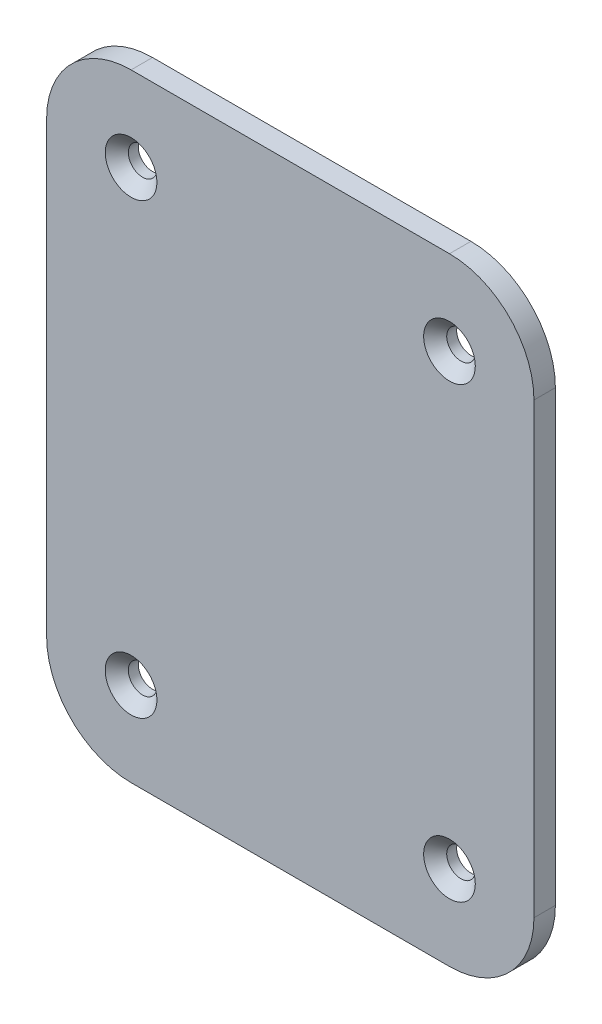
ISO-10303-21;
HEADER;
FILE_DESCRIPTION(('STEP AP214'),'2;1');
FILE_NAME('part.step','',(''),(''),'','','');
FILE_SCHEMA(('AUTOMOTIVE_DESIGN { 1 0 10303 214 1 1 1 1 }'));
ENDSEC;
DATA;
#1=APPLICATION_CONTEXT('core data for automotive mechanical design processes');
#2=APPLICATION_PROTOCOL_DEFINITION('international standard','automotive_design',2000,#1);
#3=PRODUCT_CONTEXT('',#1,'mechanical');
#4=PRODUCT('Part','Part','',(#3));
#5=PRODUCT_RELATED_PRODUCT_CATEGORY('part','',(#4));
#6=PRODUCT_DEFINITION_FORMATION('','',#4);
#7=PRODUCT_DEFINITION_CONTEXT('part definition',#1,'design');
#8=PRODUCT_DEFINITION('design','',#6,#7);
#9=PRODUCT_DEFINITION_SHAPE('','',#8);
#10=(LENGTH_UNIT() NAMED_UNIT(*) SI_UNIT(.MILLI.,.METRE.));
#11=(NAMED_UNIT(*) PLANE_ANGLE_UNIT() SI_UNIT($,.RADIAN.));
#12=(NAMED_UNIT(*) SI_UNIT($,.STERADIAN.) SOLID_ANGLE_UNIT());
#13=UNCERTAINTY_MEASURE_WITH_UNIT(LENGTH_MEASURE(1.E-05),#10,'distance_accuracy_value','');
#14=(GEOMETRIC_REPRESENTATION_CONTEXT(3) GLOBAL_UNCERTAINTY_ASSIGNED_CONTEXT((#13)) GLOBAL_UNIT_ASSIGNED_CONTEXT((#10,
#11,#12)) REPRESENTATION_CONTEXT('',''));
#15=CARTESIAN_POINT('',(0.,0.,0.));
#16=DIRECTION('',(0.,0.,1.));
#17=DIRECTION('',(1.,0.,0.));
#18=AXIS2_PLACEMENT_3D('',#15,#16,#17);
#19=CARTESIAN_POINT('',(24.5,-34.5,156.037184369141));
#20=DIRECTION('',(0.,0.,-1.));
#21=DIRECTION('',(-1.,0.,0.));
#22=AXIS2_PLACEMENT_3D('',#19,#20,#21);
#23=CYLINDRICAL_SURFACE('',#22,13.);
#24=DIRECTION('',(0.,0.,-1.));
#25=VECTOR('',#24,1.);
#26=CARTESIAN_POINT('',(24.4999999999891,-47.5,156.037184369141));
#27=LINE('',#26,#25);
#28=CARTESIAN_POINT('',(24.4999999999891,-47.5,35.));
#29=VERTEX_POINT('',#28);
#30=CARTESIAN_POINT('',(24.4999999999891,-47.5,31.7));
#31=VERTEX_POINT('',#30);
#32=EDGE_CURVE('E146',#29,#31,#27,.T.);
#33=ORIENTED_EDGE('',*,*,#32,.T.);
#34=CARTESIAN_POINT('',(24.5,-34.5,31.7));
#35=DIRECTION('',(0.,0.,1.));
#36=DIRECTION('',(1.,0.,0.));
#37=AXIS2_PLACEMENT_3D('',#34,#35,#36);
#38=CIRCLE('',#37,13.);
#39=CARTESIAN_POINT('',(37.5000000000209,-34.49999999998,31.7));
#40=VERTEX_POINT('',#39);
#41=EDGE_CURVE('E43',#31,#40,#38,.T.);
#42=ORIENTED_EDGE('',*,*,#41,.T.);
#43=DIRECTION('',(0.,0.,-1.));
#44=VECTOR('',#43,1.);
#45=CARTESIAN_POINT('',(37.5000000000209,-34.49999999998,156.037184369141));
#46=LINE('',#45,#44);
#47=CARTESIAN_POINT('',(37.5000000000209,-34.49999999998,35.));
#48=VERTEX_POINT('',#47);
#49=EDGE_CURVE('E148',#48,#40,#46,.T.);
#50=ORIENTED_EDGE('',*,*,#49,.F.);
#51=CARTESIAN_POINT('',(24.5,-34.5,35.));
#52=DIRECTION('',(0.,0.,1.));
#53=DIRECTION('',(1.,0.,0.));
#54=AXIS2_PLACEMENT_3D('',#51,#52,#53);
#55=CIRCLE('',#54,13.);
#56=EDGE_CURVE('E142',#29,#48,#55,.T.);
#57=ORIENTED_EDGE('',*,*,#56,.F.);
#58=EDGE_LOOP('',(#33,#42,#50,#57));
#59=FACE_BOUND('',#58,.T.);
#60=ADVANCED_FACE('F34',(#59),#23,.T.);
#61=CARTESIAN_POINT('',(37.5000000000796,-291545.,156.037184369141));
#62=DIRECTION('',(-1.,0.,0.));
#63=DIRECTION('',(0.,-1.,0.));
#64=AXIS2_PLACEMENT_3D('',#61,#62,#63);
#65=PLANE('',#64);
#66=ORIENTED_EDGE('',*,*,#49,.T.);
#67=DIRECTION('',(0.,1.,0.));
#68=VECTOR('',#67,1.);
#69=CARTESIAN_POINT('',(37.5000000000796,-291545.,31.7));
#70=LINE('',#69,#68);
#71=CARTESIAN_POINT('',(37.5,34.5000000000368,31.7));
#72=VERTEX_POINT('',#71);
#73=EDGE_CURVE('E170',#40,#72,#70,.T.);
#74=ORIENTED_EDGE('',*,*,#73,.T.);
#75=DIRECTION('',(0.,0.,-1.));
#76=VECTOR('',#75,1.);
#77=CARTESIAN_POINT('',(37.5,34.5000000000368,156.037184369141));
#78=LINE('',#77,#76);
#79=CARTESIAN_POINT('',(37.5,34.5000000000368,35.));
#80=VERTEX_POINT('',#79);
#81=EDGE_CURVE('E151',#80,#72,#78,.T.);
#82=ORIENTED_EDGE('',*,*,#81,.F.);
#83=DIRECTION('',(0.,1.,0.));
#84=VECTOR('',#83,1.);
#85=CARTESIAN_POINT('',(37.5000000000796,-291545.,35.));
#86=LINE('',#85,#84);
#87=EDGE_CURVE('E139',#48,#80,#86,.T.);
#88=ORIENTED_EDGE('',*,*,#87,.F.);
#89=EDGE_LOOP('',(#66,#74,#82,#88));
#90=FACE_BOUND('',#89,.T.);
#91=ADVANCED_FACE('F239',(#90),#65,.F.);
#92=CARTESIAN_POINT('',(24.5,34.5,156.037184369141));
#93=DIRECTION('',(0.,0.,-1.));
#94=DIRECTION('',(-1.,0.,0.));
#95=AXIS2_PLACEMENT_3D('',#92,#93,#94);
#96=CYLINDRICAL_SURFACE('',#95,13.);
#97=ORIENTED_EDGE('',*,*,#81,.T.);
#98=CARTESIAN_POINT('',(24.5,34.5,31.7));
#99=DIRECTION('',(0.,0.,1.));
#100=DIRECTION('',(1.,0.,0.));
#101=AXIS2_PLACEMENT_3D('',#98,#99,#100);
#102=CIRCLE('',#101,13.);
#103=CARTESIAN_POINT('',(24.4999999999891,47.5000000000136,31.7));
#104=VERTEX_POINT('',#103);
#105=EDGE_CURVE('E168',#72,#104,#102,.T.);
#106=ORIENTED_EDGE('',*,*,#105,.T.);
#107=DIRECTION('',(0.,0.,-1.));
#108=VECTOR('',#107,1.);
#109=CARTESIAN_POINT('',(24.4999999999891,47.5000000000136,156.037184369141));
#110=LINE('',#109,#108);
#111=CARTESIAN_POINT('',(24.4999999999891,47.5000000000136,35.));
#112=VERTEX_POINT('',#111);
#113=EDGE_CURVE('E154',#112,#104,#110,.T.);
#114=ORIENTED_EDGE('',*,*,#113,.F.);
#115=CARTESIAN_POINT('',(24.5,34.5,35.));
#116=DIRECTION('',(0.,0.,1.));
#117=DIRECTION('',(1.,0.,0.));
#118=AXIS2_PLACEMENT_3D('',#115,#116,#117);
#119=CIRCLE('',#118,13.);
#120=EDGE_CURVE('E136',#80,#112,#119,.T.);
#121=ORIENTED_EDGE('',*,*,#120,.F.);
#122=EDGE_LOOP('',(#97,#106,#114,#121));
#123=FACE_BOUND('',#122,.T.);
#124=ADVANCED_FACE('F235',(#123),#96,.T.);
#125=CARTESIAN_POINT('',(-400000.,47.5000000000136,156.037184369141));
#126=DIRECTION('',(0.,-1.,0.));
#127=DIRECTION('',(0.,0.,-1.));
#128=AXIS2_PLACEMENT_3D('',#125,#126,#127);
#129=PLANE('',#128);
#130=ORIENTED_EDGE('',*,*,#113,.T.);
#131=DIRECTION('',(-1.,0.,0.));
#132=VECTOR('',#131,1.);
#133=CARTESIAN_POINT('',(-400000.,47.5000000000136,31.7));
#134=LINE('',#133,#132);
#135=CARTESIAN_POINT('',(-24.4999999999891,47.5,31.7));
#136=VERTEX_POINT('',#135);
#137=EDGE_CURVE('E166',#104,#136,#134,.T.);
#138=ORIENTED_EDGE('',*,*,#137,.T.);
#139=DIRECTION('',(0.,0.,-1.));
#140=VECTOR('',#139,1.);
#141=CARTESIAN_POINT('',(-24.4999999999891,47.5,156.037184369141));
#142=LINE('',#141,#140);
#143=CARTESIAN_POINT('',(-24.4999999999891,47.5,35.));
#144=VERTEX_POINT('',#143);
#145=EDGE_CURVE('E157',#144,#136,#142,.T.);
#146=ORIENTED_EDGE('',*,*,#145,.F.);
#147=DIRECTION('',(-1.,0.,0.));
#148=VECTOR('',#147,1.);
#149=CARTESIAN_POINT('',(-400000.,47.5000000000136,35.));
#150=LINE('',#149,#148);
#151=EDGE_CURVE('E129',#112,#144,#150,.T.);
#152=ORIENTED_EDGE('',*,*,#151,.F.);
#153=EDGE_LOOP('',(#130,#138,#146,#152));
#154=FACE_BOUND('',#153,.T.);
#155=ADVANCED_FACE('F231',(#154),#129,.F.);
#156=CARTESIAN_POINT('',(-24.5,34.5,156.037184369141));
#157=DIRECTION('',(0.,0.,-1.));
#158=DIRECTION('',(-1.,0.,0.));
#159=AXIS2_PLACEMENT_3D('',#156,#157,#158);
#160=CYLINDRICAL_SURFACE('',#159,13.);
#161=ORIENTED_EDGE('',*,*,#145,.T.);
#162=CARTESIAN_POINT('',(-24.5,34.5,31.7));
#163=DIRECTION('',(0.,0.,1.));
#164=DIRECTION('',(1.,0.,0.));
#165=AXIS2_PLACEMENT_3D('',#162,#163,#164);
#166=CIRCLE('',#165,13.);
#167=CARTESIAN_POINT('',(-37.5000000000245,34.49999999998,31.7));
#168=VERTEX_POINT('',#167);
#169=EDGE_CURVE('E164',#136,#168,#166,.T.);
#170=ORIENTED_EDGE('',*,*,#169,.T.);
#171=DIRECTION('',(0.,0.,-1.));
#172=VECTOR('',#171,1.);
#173=CARTESIAN_POINT('',(-37.5000000000245,34.49999999998,156.037184369141));
#174=LINE('',#173,#172);
#175=CARTESIAN_POINT('',(-37.5000000000245,34.49999999998,35.));
#176=VERTEX_POINT('',#175);
#177=EDGE_CURVE('E112',#176,#168,#174,.T.);
#178=ORIENTED_EDGE('',*,*,#177,.F.);
#179=CARTESIAN_POINT('',(-24.5,34.5,35.));
#180=DIRECTION('',(0.,0.,1.));
#181=DIRECTION('',(1.,0.,0.));
#182=AXIS2_PLACEMENT_3D('',#179,#180,#181);
#183=CIRCLE('',#182,13.);
#184=EDGE_CURVE('E125',#144,#176,#183,.T.);
#185=ORIENTED_EDGE('',*,*,#184,.F.);
#186=EDGE_LOOP('',(#161,#170,#178,#185));
#187=FACE_BOUND('',#186,.T.);
#188=ADVANCED_FACE('F228',(#187),#160,.T.);
#189=CARTESIAN_POINT('',(0.,0.,35.));
#190=DIRECTION('',(0.,0.,1.));
#191=DIRECTION('',(1.,0.,0.));
#192=AXIS2_PLACEMENT_3D('',#189,#190,#191);
#193=PLANE('',#192);
#194=CARTESIAN_POINT('',(24.5,-34.5,35.));
#195=DIRECTION('',(0.,0.,1.));
#196=DIRECTION('',(1.,0.,0.));
#197=AXIS2_PLACEMENT_3D('',#194,#195,#196);
#198=CIRCLE('',#197,3.975);
#199=CARTESIAN_POINT('',(28.475,-34.5,35.));
#200=VERTEX_POINT('',#199);
#201=EDGE_CURVE('E254',#200,#200,#198,.T.);
#202=ORIENTED_EDGE('',*,*,#201,.F.);
#203=EDGE_LOOP('',(#202));
#204=FACE_BOUND('',#203,.T.);
#205=CARTESIAN_POINT('',(-24.5,34.5,35.));
#206=DIRECTION('',(0.,0.,1.));
#207=DIRECTION('',(1.,0.,0.));
#208=AXIS2_PLACEMENT_3D('',#205,#206,#207);
#209=CIRCLE('',#208,3.975);
#210=CARTESIAN_POINT('',(-20.525,34.5,35.));
#211=VERTEX_POINT('',#210);
#212=EDGE_CURVE('E188',#211,#211,#209,.T.);
#213=ORIENTED_EDGE('',*,*,#212,.F.);
#214=EDGE_LOOP('',(#213));
#215=FACE_BOUND('',#214,.T.);
#216=CARTESIAN_POINT('',(24.5,34.5,35.));
#217=DIRECTION('',(0.,0.,1.));
#218=DIRECTION('',(1.,0.,0.));
#219=AXIS2_PLACEMENT_3D('',#216,#217,#218);
#220=CIRCLE('',#219,3.975);
#221=CARTESIAN_POINT('',(28.475,34.5,35.));
#222=VERTEX_POINT('',#221);
#223=EDGE_CURVE('E181',#222,#222,#220,.T.);
#224=ORIENTED_EDGE('',*,*,#223,.F.);
#225=EDGE_LOOP('',(#224));
#226=FACE_BOUND('',#225,.T.);
#227=CARTESIAN_POINT('',(-24.5,-34.5,35.));
#228=DIRECTION('',(0.,0.,1.));
#229=DIRECTION('',(1.,0.,0.));
#230=AXIS2_PLACEMENT_3D('',#227,#228,#229);
#231=CIRCLE('',#230,3.975);
#232=CARTESIAN_POINT('',(-20.525,-34.5,35.));
#233=VERTEX_POINT('',#232);
#234=EDGE_CURVE('E177',#233,#233,#231,.T.);
#235=ORIENTED_EDGE('',*,*,#234,.F.);
#236=EDGE_LOOP('',(#235));
#237=FACE_BOUND('',#236,.T.);
#238=CARTESIAN_POINT('',(-24.5,-34.5,35.));
#239=DIRECTION('',(0.,0.,1.));
#240=DIRECTION('',(1.,0.,0.));
#241=AXIS2_PLACEMENT_3D('',#238,#239,#240);
#242=CIRCLE('',#241,13.);
#243=CARTESIAN_POINT('',(-37.5,-34.5000000000368,35.));
#244=VERTEX_POINT('',#243);
#245=CARTESIAN_POINT('',(-24.4999999999891,-47.5,35.));
#246=VERTEX_POINT('',#245);
#247=EDGE_CURVE('E111',#244,#246,#242,.T.);
#248=ORIENTED_EDGE('',*,*,#247,.T.);
#249=DIRECTION('',(1.,0.,0.));
#250=VECTOR('',#249,1.);
#251=CARTESIAN_POINT('',(-400000.,-47.5000000000136,35.));
#252=LINE('',#251,#250);
#253=EDGE_CURVE('E120',#246,#29,#252,.T.);
#254=ORIENTED_EDGE('',*,*,#253,.T.);
#255=ORIENTED_EDGE('',*,*,#56,.T.);
#256=ORIENTED_EDGE('',*,*,#87,.T.);
#257=ORIENTED_EDGE('',*,*,#120,.T.);
#258=ORIENTED_EDGE('',*,*,#151,.T.);
#259=ORIENTED_EDGE('',*,*,#184,.T.);
#260=DIRECTION('',(0.,-1.,0.));
#261=VECTOR('',#260,1.);
#262=CARTESIAN_POINT('',(-37.4999999999659,-291545.,35.));
#263=LINE('',#262,#261);
#264=EDGE_CURVE('E104',#176,#244,#263,.T.);
#265=ORIENTED_EDGE('',*,*,#264,.T.);
#266=EDGE_LOOP('',(#248,#254,#255,#256,#257,#258,#259,#265));
#267=FACE_BOUND('',#266,.T.);
#268=ADVANCED_FACE('F123',(#204,#215,#226,#237,#267),#193,.T.);
#269=CARTESIAN_POINT('',(-400000.,-47.5000000000136,156.037184369141));
#270=DIRECTION('',(0.,1.,0.));
#271=DIRECTION('',(0.,0.,1.));
#272=AXIS2_PLACEMENT_3D('',#269,#270,#271);
#273=PLANE('',#272);
#274=DIRECTION('',(0.,0.,-1.));
#275=VECTOR('',#274,1.);
#276=CARTESIAN_POINT('',(-24.4999999999891,-47.5,156.037184369141));
#277=LINE('',#276,#275);
#278=CARTESIAN_POINT('',(-24.4999999999891,-47.5,31.7));
#279=VERTEX_POINT('',#278);
#280=EDGE_CURVE('E116',#246,#279,#277,.T.);
#281=ORIENTED_EDGE('',*,*,#280,.T.);
#282=DIRECTION('',(1.,0.,0.));
#283=VECTOR('',#282,1.);
#284=CARTESIAN_POINT('',(-400000.,-47.5000000000136,31.7));
#285=LINE('',#284,#283);
#286=EDGE_CURVE('E11',#279,#31,#285,.T.);
#287=ORIENTED_EDGE('',*,*,#286,.T.);
#288=ORIENTED_EDGE('',*,*,#32,.F.);
#289=ORIENTED_EDGE('',*,*,#253,.F.);
#290=EDGE_LOOP('',(#281,#287,#288,#289));
#291=FACE_BOUND('',#290,.T.);
#292=ADVANCED_FACE('F225',(#291),#273,.F.);
#293=CARTESIAN_POINT('',(-37.4999999999659,-291545.,156.037184369141));
#294=DIRECTION('',(1.,0.,0.));
#295=DIRECTION('',(0.,1.,0.));
#296=AXIS2_PLACEMENT_3D('',#293,#294,#295);
#297=PLANE('',#296);
#298=ORIENTED_EDGE('',*,*,#177,.T.);
#299=DIRECTION('',(0.,-1.,0.));
#300=VECTOR('',#299,1.);
#301=CARTESIAN_POINT('',(-37.4999999999659,-291545.,31.7));
#302=LINE('',#301,#300);
#303=CARTESIAN_POINT('',(-37.5,-34.5000000000368,31.7));
#304=VERTEX_POINT('',#303);
#305=EDGE_CURVE('E107',#168,#304,#302,.T.);
#306=ORIENTED_EDGE('',*,*,#305,.T.);
#307=DIRECTION('',(0.,0.,-1.));
#308=VECTOR('',#307,1.);
#309=CARTESIAN_POINT('',(-37.5,-34.5000000000368,156.037184369141));
#310=LINE('',#309,#308);
#311=EDGE_CURVE('E99',#244,#304,#310,.T.);
#312=ORIENTED_EDGE('',*,*,#311,.F.);
#313=ORIENTED_EDGE('',*,*,#264,.F.);
#314=EDGE_LOOP('',(#298,#306,#312,#313));
#315=FACE_BOUND('',#314,.T.);
#316=ADVANCED_FACE('F102',(#315),#297,.F.);
#317=CARTESIAN_POINT('',(-24.5,-34.5,156.037184369141));
#318=DIRECTION('',(0.,0.,-1.));
#319=DIRECTION('',(-1.,0.,0.));
#320=AXIS2_PLACEMENT_3D('',#317,#318,#319);
#321=CYLINDRICAL_SURFACE('',#320,13.);
#322=ORIENTED_EDGE('',*,*,#311,.T.);
#323=CARTESIAN_POINT('',(-24.5,-34.5,31.7));
#324=DIRECTION('',(0.,0.,1.));
#325=DIRECTION('',(1.,0.,0.));
#326=AXIS2_PLACEMENT_3D('',#323,#324,#325);
#327=CIRCLE('',#326,13.);
#328=EDGE_CURVE('E126',#304,#279,#327,.T.);
#329=ORIENTED_EDGE('',*,*,#328,.T.);
#330=ORIENTED_EDGE('',*,*,#280,.F.);
#331=ORIENTED_EDGE('',*,*,#247,.F.);
#332=EDGE_LOOP('',(#322,#329,#330,#331));
#333=FACE_BOUND('',#332,.T.);
#334=ADVANCED_FACE('F115',(#333),#321,.T.);
#335=CARTESIAN_POINT('',(0.,0.,31.7));
#336=DIRECTION('',(0.,0.,1.));
#337=DIRECTION('',(1.,0.,0.));
#338=AXIS2_PLACEMENT_3D('',#335,#336,#337);
#339=PLANE('',#338);
#340=CARTESIAN_POINT('',(24.5,-34.5,31.7));
#341=DIRECTION('',(0.,0.,1.));
#342=DIRECTION('',(1.,0.,0.));
#343=AXIS2_PLACEMENT_3D('',#340,#341,#342);
#344=CIRCLE('',#343,2.19999999999999);
#345=CARTESIAN_POINT('',(26.7,-34.5,31.7));
#346=VERTEX_POINT('',#345);
#347=EDGE_CURVE('E38',#346,#346,#344,.T.);
#348=ORIENTED_EDGE('',*,*,#347,.T.);
#349=EDGE_LOOP('',(#348));
#350=FACE_BOUND('',#349,.T.);
#351=CARTESIAN_POINT('',(-24.5,34.5,31.7));
#352=DIRECTION('',(0.,0.,1.));
#353=DIRECTION('',(1.,0.,0.));
#354=AXIS2_PLACEMENT_3D('',#351,#352,#353);
#355=CIRCLE('',#354,2.19999999999999);
#356=CARTESIAN_POINT('',(-22.3,34.5,31.7));
#357=VERTEX_POINT('',#356);
#358=EDGE_CURVE('E179',#357,#357,#355,.T.);
#359=ORIENTED_EDGE('',*,*,#358,.T.);
#360=EDGE_LOOP('',(#359));
#361=FACE_BOUND('',#360,.T.);
#362=CARTESIAN_POINT('',(24.5,34.5,31.7));
#363=DIRECTION('',(0.,0.,1.));
#364=DIRECTION('',(1.,0.,0.));
#365=AXIS2_PLACEMENT_3D('',#362,#363,#364);
#366=CIRCLE('',#365,2.19999999999999);
#367=CARTESIAN_POINT('',(26.7,34.5,31.7));
#368=VERTEX_POINT('',#367);
#369=EDGE_CURVE('E175',#368,#368,#366,.T.);
#370=ORIENTED_EDGE('',*,*,#369,.T.);
#371=EDGE_LOOP('',(#370));
#372=FACE_BOUND('',#371,.T.);
#373=CARTESIAN_POINT('',(-24.5,-34.5,31.7));
#374=DIRECTION('',(0.,0.,1.));
#375=DIRECTION('',(1.,0.,0.));
#376=AXIS2_PLACEMENT_3D('',#373,#374,#375);
#377=CIRCLE('',#376,2.19999999999999);
#378=CARTESIAN_POINT('',(-22.3,-34.5,31.7));
#379=VERTEX_POINT('',#378);
#380=EDGE_CURVE('E161',#379,#379,#377,.T.);
#381=ORIENTED_EDGE('',*,*,#380,.T.);
#382=EDGE_LOOP('',(#381));
#383=FACE_BOUND('',#382,.T.);
#384=ORIENTED_EDGE('',*,*,#328,.F.);
#385=ORIENTED_EDGE('',*,*,#305,.F.);
#386=ORIENTED_EDGE('',*,*,#169,.F.);
#387=ORIENTED_EDGE('',*,*,#137,.F.);
#388=ORIENTED_EDGE('',*,*,#105,.F.);
#389=ORIENTED_EDGE('',*,*,#73,.F.);
#390=ORIENTED_EDGE('',*,*,#41,.F.);
#391=ORIENTED_EDGE('',*,*,#286,.F.);
#392=EDGE_LOOP('',(#384,#385,#386,#387,#388,#389,#390,#391));
#393=FACE_BOUND('',#392,.T.);
#394=ADVANCED_FACE('F36',(#350,#361,#372,#383,#393),#339,.F.);
#395=CARTESIAN_POINT('',(-24.5,-34.5,35.));
#396=DIRECTION('',(0.,0.,1.));
#397=DIRECTION('',(1.,0.,0.));
#398=AXIS2_PLACEMENT_3D('',#395,#396,#397);
#399=CYLINDRICAL_SURFACE('',#398,2.19999999999999);
#400=CARTESIAN_POINT('',(-24.5,-34.5,33.225));
#401=DIRECTION('',(0.,0.,1.));
#402=DIRECTION('',(1.,0.,0.));
#403=AXIS2_PLACEMENT_3D('',#400,#401,#402);
#404=CIRCLE('',#403,2.19999999999999);
#405=CARTESIAN_POINT('',(-22.3,-34.5,33.225));
#406=VERTEX_POINT('',#405);
#407=EDGE_CURVE('E132',#406,#406,#404,.T.);
#408=ORIENTED_EDGE('',*,*,#407,.T.);
#409=EDGE_LOOP('',(#408));
#410=FACE_BOUND('',#409,.T.);
#411=ORIENTED_EDGE('',*,*,#380,.F.);
#412=EDGE_LOOP('',(#411));
#413=FACE_BOUND('',#412,.T.);
#414=ADVANCED_FACE('F203',(#410,#413),#399,.F.);
#415=CARTESIAN_POINT('',(-24.5,-34.5,35.));
#416=DIRECTION('',(0.,0.,1.));
#417=DIRECTION('',(1.,0.,0.));
#418=AXIS2_PLACEMENT_3D('',#415,#416,#417);
#419=CONICAL_SURFACE('',#418,3.975,0.785398163397452);
#420=ORIENTED_EDGE('',*,*,#407,.F.);
#421=EDGE_LOOP('',(#420));
#422=FACE_BOUND('',#421,.T.);
#423=ORIENTED_EDGE('',*,*,#234,.T.);
#424=EDGE_LOOP('',(#423));
#425=FACE_BOUND('',#424,.T.);
#426=ADVANCED_FACE('F206',(#422,#425),#419,.F.);
#427=CARTESIAN_POINT('',(24.5,34.5,35.));
#428=DIRECTION('',(0.,0.,1.));
#429=DIRECTION('',(1.,0.,0.));
#430=AXIS2_PLACEMENT_3D('',#427,#428,#429);
#431=CYLINDRICAL_SURFACE('',#430,2.19999999999999);
#432=CARTESIAN_POINT('',(24.5,34.5,33.225));
#433=DIRECTION('',(0.,0.,1.));
#434=DIRECTION('',(1.,0.,0.));
#435=AXIS2_PLACEMENT_3D('',#432,#433,#434);
#436=CIRCLE('',#435,2.19999999999999);
#437=CARTESIAN_POINT('',(26.7,34.5,33.225));
#438=VERTEX_POINT('',#437);
#439=EDGE_CURVE('E178',#438,#438,#436,.T.);
#440=ORIENTED_EDGE('',*,*,#439,.T.);
#441=EDGE_LOOP('',(#440));
#442=FACE_BOUND('',#441,.T.);
#443=ORIENTED_EDGE('',*,*,#369,.F.);
#444=EDGE_LOOP('',(#443));
#445=FACE_BOUND('',#444,.T.);
#446=ADVANCED_FACE('F208',(#442,#445),#431,.F.);
#447=CARTESIAN_POINT('',(24.5,34.5,35.));
#448=DIRECTION('',(0.,0.,1.));
#449=DIRECTION('',(1.,0.,0.));
#450=AXIS2_PLACEMENT_3D('',#447,#448,#449);
#451=CONICAL_SURFACE('',#450,3.975,0.785398163397452);
#452=ORIENTED_EDGE('',*,*,#439,.F.);
#453=EDGE_LOOP('',(#452));
#454=FACE_BOUND('',#453,.T.);
#455=ORIENTED_EDGE('',*,*,#223,.T.);
#456=EDGE_LOOP('',(#455));
#457=FACE_BOUND('',#456,.T.);
#458=ADVANCED_FACE('F214',(#454,#457),#451,.F.);
#459=CARTESIAN_POINT('',(-24.5,34.5,35.));
#460=DIRECTION('',(0.,0.,1.));
#461=DIRECTION('',(1.,0.,0.));
#462=AXIS2_PLACEMENT_3D('',#459,#460,#461);
#463=CYLINDRICAL_SURFACE('',#462,2.19999999999999);
#464=CARTESIAN_POINT('',(-24.5,34.5,33.225));
#465=DIRECTION('',(0.,0.,1.));
#466=DIRECTION('',(1.,0.,0.));
#467=AXIS2_PLACEMENT_3D('',#464,#465,#466);
#468=CIRCLE('',#467,2.19999999999999);
#469=CARTESIAN_POINT('',(-22.3,34.5,33.225));
#470=VERTEX_POINT('',#469);
#471=EDGE_CURVE('E182',#470,#470,#468,.T.);
#472=ORIENTED_EDGE('',*,*,#471,.T.);
#473=EDGE_LOOP('',(#472));
#474=FACE_BOUND('',#473,.T.);
#475=ORIENTED_EDGE('',*,*,#358,.F.);
#476=EDGE_LOOP('',(#475));
#477=FACE_BOUND('',#476,.T.);
#478=ADVANCED_FACE('F261',(#474,#477),#463,.F.);
#479=CARTESIAN_POINT('',(-24.5,34.5,35.));
#480=DIRECTION('',(0.,0.,1.));
#481=DIRECTION('',(1.,0.,0.));
#482=AXIS2_PLACEMENT_3D('',#479,#480,#481);
#483=CONICAL_SURFACE('',#482,3.975,0.785398163397452);
#484=ORIENTED_EDGE('',*,*,#471,.F.);
#485=EDGE_LOOP('',(#484));
#486=FACE_BOUND('',#485,.T.);
#487=ORIENTED_EDGE('',*,*,#212,.T.);
#488=EDGE_LOOP('',(#487));
#489=FACE_BOUND('',#488,.T.);
#490=ADVANCED_FACE('F267',(#486,#489),#483,.F.);
#491=CARTESIAN_POINT('',(24.5,-34.5,35.));
#492=DIRECTION('',(0.,0.,1.));
#493=DIRECTION('',(1.,0.,0.));
#494=AXIS2_PLACEMENT_3D('',#491,#492,#493);
#495=CYLINDRICAL_SURFACE('',#494,2.19999999999999);
#496=CARTESIAN_POINT('',(24.5,-34.5,33.225));
#497=DIRECTION('',(0.,0.,1.));
#498=DIRECTION('',(1.,0.,0.));
#499=AXIS2_PLACEMENT_3D('',#496,#497,#498);
#500=CIRCLE('',#499,2.19999999999999);
#501=CARTESIAN_POINT('',(26.7,-34.5,33.225));
#502=VERTEX_POINT('',#501);
#503=EDGE_CURVE('E286',#502,#502,#500,.T.);
#504=ORIENTED_EDGE('',*,*,#503,.T.);
#505=EDGE_LOOP('',(#504));
#506=FACE_BOUND('',#505,.T.);
#507=ORIENTED_EDGE('',*,*,#347,.F.);
#508=EDGE_LOOP('',(#507));
#509=FACE_BOUND('',#508,.T.);
#510=ADVANCED_FACE('F273',(#506,#509),#495,.F.);
#511=CARTESIAN_POINT('',(24.5,-34.5,35.));
#512=DIRECTION('',(0.,0.,1.));
#513=DIRECTION('',(1.,0.,0.));
#514=AXIS2_PLACEMENT_3D('',#511,#512,#513);
#515=CONICAL_SURFACE('',#514,3.975,0.785398163397452);
#516=ORIENTED_EDGE('',*,*,#503,.F.);
#517=EDGE_LOOP('',(#516));
#518=FACE_BOUND('',#517,.T.);
#519=ORIENTED_EDGE('',*,*,#201,.T.);
#520=EDGE_LOOP('',(#519));
#521=FACE_BOUND('',#520,.T.);
#522=ADVANCED_FACE('F277',(#518,#521),#515,.F.);
#523=CLOSED_SHELL('',(#60,#91,#124,#155,#188,#268,#292,#316,#334,#394,#414,#426,#446,#458,#478,
#490,#510,#522));
#524=MANIFOLD_SOLID_BREP('B2',#523);
#525=ADVANCED_BREP_SHAPE_REPRESENTATION('',(#18,#524),#14);
#526=SHAPE_DEFINITION_REPRESENTATION(#9,#525);
ENDSEC;
END-ISO-10303-21;
